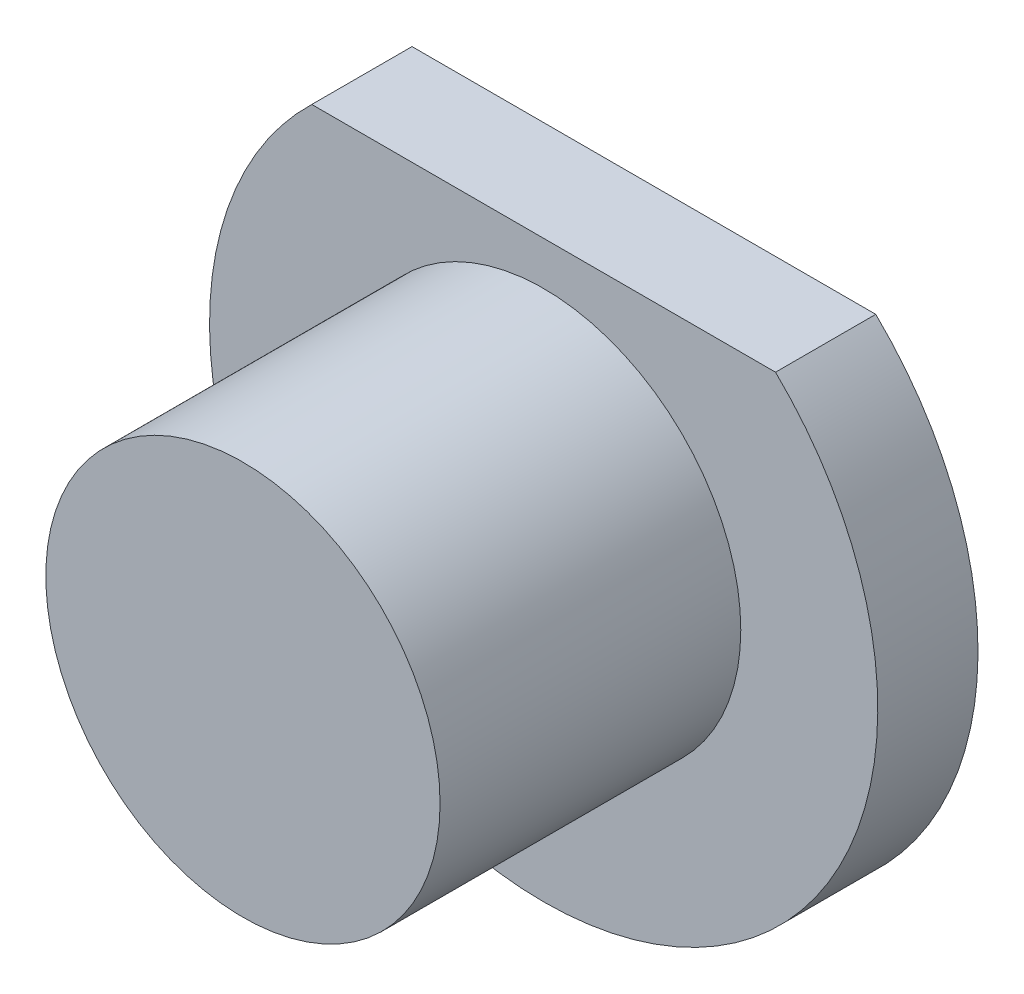
ISO-10303-21;
HEADER;
FILE_DESCRIPTION(('STEP AP214'),'2;1');
FILE_NAME('part.step','',(''),(''),'','','');
FILE_SCHEMA(('AUTOMOTIVE_DESIGN { 1 0 10303 214 1 1 1 1 }'));
ENDSEC;
DATA;
#1=APPLICATION_CONTEXT('core data for automotive mechanical design processes');
#2=APPLICATION_PROTOCOL_DEFINITION('international standard','automotive_design',2000,#1);
#3=PRODUCT_CONTEXT('',#1,'mechanical');
#4=PRODUCT('Part','Part','',(#3));
#5=PRODUCT_RELATED_PRODUCT_CATEGORY('part','',(#4));
#6=PRODUCT_DEFINITION_FORMATION('','',#4);
#7=PRODUCT_DEFINITION_CONTEXT('part definition',#1,'design');
#8=PRODUCT_DEFINITION('design','',#6,#7);
#9=PRODUCT_DEFINITION_SHAPE('','',#8);
#10=(LENGTH_UNIT() NAMED_UNIT(*) SI_UNIT(.MILLI.,.METRE.));
#11=(NAMED_UNIT(*) PLANE_ANGLE_UNIT() SI_UNIT($,.RADIAN.));
#12=(NAMED_UNIT(*) SI_UNIT($,.STERADIAN.) SOLID_ANGLE_UNIT());
#13=UNCERTAINTY_MEASURE_WITH_UNIT(LENGTH_MEASURE(1.E-05),#10,'distance_accuracy_value','');
#14=(GEOMETRIC_REPRESENTATION_CONTEXT(3) GLOBAL_UNCERTAINTY_ASSIGNED_CONTEXT((#13)) GLOBAL_UNIT_ASSIGNED_CONTEXT((#10,
#11,#12)) REPRESENTATION_CONTEXT('',''));
#15=CARTESIAN_POINT('',(0.,0.,0.));
#16=DIRECTION('',(0.,0.,1.));
#17=DIRECTION('',(1.,0.,0.));
#18=AXIS2_PLACEMENT_3D('',#15,#16,#17);
#19=CARTESIAN_POINT('',(0.,0.,4.5));
#20=DIRECTION('',(0.,0.,-1.));
#21=DIRECTION('',(-1.,0.,0.));
#22=AXIS2_PLACEMENT_3D('',#19,#20,#21);
#23=CYLINDRICAL_SURFACE('',#22,2.95);
#24=CARTESIAN_POINT('',(0.,0.,0.));
#25=DIRECTION('',(0.,0.,1.));
#26=DIRECTION('',(1.,0.,0.));
#27=AXIS2_PLACEMENT_3D('',#24,#25,#26);
#28=CIRCLE('',#27,2.95);
#29=CARTESIAN_POINT('',(2.95,0.,0.));
#30=VERTEX_POINT('',#29);
#31=EDGE_CURVE('E77',#30,#30,#28,.T.);
#32=ORIENTED_EDGE('',*,*,#31,.T.);
#33=EDGE_LOOP('',(#32));
#34=FACE_BOUND('',#33,.T.);
#35=CARTESIAN_POINT('',(0.,0.,4.5));
#36=DIRECTION('',(0.,0.,1.));
#37=DIRECTION('',(1.,0.,0.));
#38=AXIS2_PLACEMENT_3D('',#35,#36,#37);
#39=CIRCLE('',#38,2.95);
#40=CARTESIAN_POINT('',(2.95,0.,4.5));
#41=VERTEX_POINT('',#40);
#42=EDGE_CURVE('E11',#41,#41,#39,.T.);
#43=ORIENTED_EDGE('',*,*,#42,.F.);
#44=EDGE_LOOP('',(#43));
#45=FACE_BOUND('',#44,.T.);
#46=ADVANCED_FACE('F39',(#34,#45),#23,.T.);
#47=CARTESIAN_POINT('',(0.,0.,4.5));
#48=DIRECTION('',(0.,0.,1.));
#49=DIRECTION('',(1.,0.,0.));
#50=AXIS2_PLACEMENT_3D('',#47,#48,#49);
#51=PLANE('',#50);
#52=ORIENTED_EDGE('',*,*,#42,.T.);
#53=EDGE_LOOP('',(#52));
#54=FACE_BOUND('',#53,.T.);
#55=ADVANCED_FACE('F106',(#54),#51,.T.);
#56=CARTESIAN_POINT('',(0.,0.,-1.5));
#57=DIRECTION('',(0.,0.,1.));
#58=DIRECTION('',(1.,0.,0.));
#59=AXIS2_PLACEMENT_3D('',#56,#57,#58);
#60=CYLINDRICAL_SURFACE('',#59,5.);
#61=CARTESIAN_POINT('',(0.,0.,0.));
#62=DIRECTION('',(0.,0.,1.));
#63=DIRECTION('',(1.,0.,0.));
#64=AXIS2_PLACEMENT_3D('',#61,#62,#63);
#65=CIRCLE('',#64,5.);
#66=CARTESIAN_POINT('',(-3.4698703145795,3.6,0.));
#67=VERTEX_POINT('',#66);
#68=CARTESIAN_POINT('',(3.4698703145795,3.6,0.));
#69=VERTEX_POINT('',#68);
#70=EDGE_CURVE('E73',#67,#69,#65,.T.);
#71=ORIENTED_EDGE('',*,*,#70,.F.);
#72=DIRECTION('',(0.,0.,1.));
#73=VECTOR('',#72,1.);
#74=CARTESIAN_POINT('',(-3.4698703145795,3.6,-1.5));
#75=LINE('',#74,#73);
#76=CARTESIAN_POINT('',(-3.4698703145795,3.6,-1.5));
#77=VERTEX_POINT('',#76);
#78=EDGE_CURVE('E48',#77,#67,#75,.T.);
#79=ORIENTED_EDGE('',*,*,#78,.F.);
#80=CARTESIAN_POINT('',(0.,0.,-1.5));
#81=DIRECTION('',(0.,0.,1.));
#82=DIRECTION('',(1.,0.,0.));
#83=AXIS2_PLACEMENT_3D('',#80,#81,#82);
#84=CIRCLE('',#83,5.);
#85=CARTESIAN_POINT('',(3.4698703145795,3.6,-1.5));
#86=VERTEX_POINT('',#85);
#87=EDGE_CURVE('E81',#77,#86,#84,.T.);
#88=ORIENTED_EDGE('',*,*,#87,.T.);
#89=DIRECTION('',(0.,0.,1.));
#90=VECTOR('',#89,1.);
#91=CARTESIAN_POINT('',(3.4698703145795,3.6,-1.5));
#92=LINE('',#91,#90);
#93=EDGE_CURVE('E61',#86,#69,#92,.T.);
#94=ORIENTED_EDGE('',*,*,#93,.T.);
#95=EDGE_LOOP('',(#71,#79,#88,#94));
#96=FACE_BOUND('',#95,.T.);
#97=ADVANCED_FACE('F74',(#96),#60,.T.);
#98=CARTESIAN_POINT('',(-3.4698703145795,3.6,-1.5));
#99=DIRECTION('',(0.,1.,0.));
#100=DIRECTION('',(-1.,0.,0.));
#101=AXIS2_PLACEMENT_3D('',#98,#99,#100);
#102=PLANE('',#101);
#103=DIRECTION('',(-1.,0.,0.));
#104=VECTOR('',#103,1.);
#105=CARTESIAN_POINT('',(-3.4698703145795,3.6,0.));
#106=LINE('',#105,#104);
#107=EDGE_CURVE('E68',#69,#67,#106,.T.);
#108=ORIENTED_EDGE('',*,*,#107,.F.);
#109=ORIENTED_EDGE('',*,*,#93,.F.);
#110=DIRECTION('',(-1.,0.,0.));
#111=VECTOR('',#110,1.);
#112=CARTESIAN_POINT('',(-3.4698703145795,3.6,-1.5));
#113=LINE('',#112,#111);
#114=EDGE_CURVE('E70',#86,#77,#113,.T.);
#115=ORIENTED_EDGE('',*,*,#114,.T.);
#116=ORIENTED_EDGE('',*,*,#78,.T.);
#117=EDGE_LOOP('',(#108,#109,#115,#116));
#118=FACE_BOUND('',#117,.T.);
#119=ADVANCED_FACE('F66',(#118),#102,.T.);
#120=CARTESIAN_POINT('',(0.,0.,0.));
#121=DIRECTION('',(0.,0.,1.));
#122=DIRECTION('',(1.,0.,0.));
#123=AXIS2_PLACEMENT_3D('',#120,#121,#122);
#124=PLANE('',#123);
#125=ORIENTED_EDGE('',*,*,#31,.F.);
#126=EDGE_LOOP('',(#125));
#127=FACE_BOUND('',#126,.T.);
#128=ORIENTED_EDGE('',*,*,#70,.T.);
#129=ORIENTED_EDGE('',*,*,#107,.T.);
#130=EDGE_LOOP('',(#128,#129));
#131=FACE_BOUND('',#130,.T.);
#132=ADVANCED_FACE('F79',(#127,#131),#124,.T.);
#133=CARTESIAN_POINT('',(0.,0.,-1.5));
#134=DIRECTION('',(0.,0.,-1.));
#135=DIRECTION('',(-1.,0.,0.));
#136=AXIS2_PLACEMENT_3D('',#133,#134,#135);
#137=PLANE('',#136);
#138=ORIENTED_EDGE('',*,*,#87,.F.);
#139=ORIENTED_EDGE('',*,*,#114,.F.);
#140=EDGE_LOOP('',(#138,#139));
#141=FACE_BOUND('',#140,.T.);
#142=ADVANCED_FACE('F96',(#141),#137,.T.);
#143=CLOSED_SHELL('',(#46,#55,#97,#119,#132,#142));
#144=MANIFOLD_SOLID_BREP('B2',#143);
#145=ADVANCED_BREP_SHAPE_REPRESENTATION('',(#18,#144),#14);
#146=SHAPE_DEFINITION_REPRESENTATION(#9,#145);
ENDSEC;
END-ISO-10303-21;
